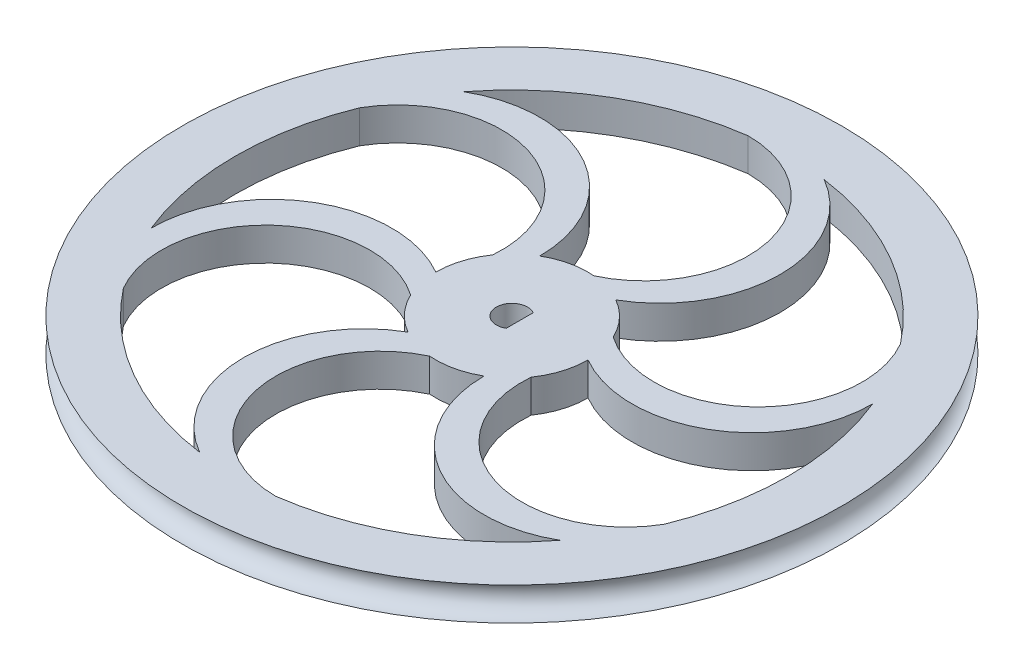
ISO-10303-21;
HEADER;
FILE_DESCRIPTION(('STEP AP214'),'2;1');
FILE_NAME('part.step','',(''),(''),'','','');
FILE_SCHEMA(('AUTOMOTIVE_DESIGN { 1 0 10303 214 1 1 1 1 }'));
ENDSEC;
DATA;
#1=APPLICATION_CONTEXT('core data for automotive mechanical design processes');
#2=APPLICATION_PROTOCOL_DEFINITION('international standard','automotive_design',2000,#1);
#3=PRODUCT_CONTEXT('',#1,'mechanical');
#4=PRODUCT('Part','Part','',(#3));
#5=PRODUCT_RELATED_PRODUCT_CATEGORY('part','',(#4));
#6=PRODUCT_DEFINITION_FORMATION('','',#4);
#7=PRODUCT_DEFINITION_CONTEXT('part definition',#1,'design');
#8=PRODUCT_DEFINITION('design','',#6,#7);
#9=PRODUCT_DEFINITION_SHAPE('','',#8);
#10=(LENGTH_UNIT() NAMED_UNIT(*) SI_UNIT(.MILLI.,.METRE.));
#11=(NAMED_UNIT(*) PLANE_ANGLE_UNIT() SI_UNIT($,.RADIAN.));
#12=(NAMED_UNIT(*) SI_UNIT($,.STERADIAN.) SOLID_ANGLE_UNIT());
#13=UNCERTAINTY_MEASURE_WITH_UNIT(LENGTH_MEASURE(1.E-05),#10,'distance_accuracy_value','');
#14=(GEOMETRIC_REPRESENTATION_CONTEXT(3) GLOBAL_UNCERTAINTY_ASSIGNED_CONTEXT((#13)) GLOBAL_UNIT_ASSIGNED_CONTEXT((#10,
#11,#12)) REPRESENTATION_CONTEXT('',''));
#15=CARTESIAN_POINT('',(0.,0.,0.));
#16=DIRECTION('',(0.,0.,1.));
#17=DIRECTION('',(1.,0.,0.));
#18=AXIS2_PLACEMENT_3D('',#15,#16,#17);
#19=CARTESIAN_POINT('',(0.,3.175,0.));
#20=DIRECTION('',(0.,1.,0.));
#21=DIRECTION('',(0.,0.,1.));
#22=AXIS2_PLACEMENT_3D('',#19,#20,#21);
#23=PLANE('',#22);
#24=CARTESIAN_POINT('',(0.,3.175,0.));
#25=DIRECTION('',(0.,1.,0.));
#26=DIRECTION('',(0.,0.,1.));
#27=AXIS2_PLACEMENT_3D('',#24,#25,#26);
#28=CIRCLE('',#27,1.5);
#29=CARTESIAN_POINT('',(0.749999999999999,3.175,-1.29903810567666));
#30=VERTEX_POINT('',#29);
#31=CARTESIAN_POINT('',(0.749999999999999,3.175,1.29903810567666));
#32=VERTEX_POINT('',#31);
#33=EDGE_CURVE('E192',#30,#32,#28,.T.);
#34=ORIENTED_EDGE('',*,*,#33,.F.);
#35=DIRECTION('',(0.,0.,-1.));
#36=VECTOR('',#35,1.);
#37=CARTESIAN_POINT('',(0.749999999999999,3.175,-1.29903810567666));
#38=LINE('',#37,#36);
#39=EDGE_CURVE('E360',#32,#30,#38,.T.);
#40=ORIENTED_EDGE('',*,*,#39,.F.);
#41=EDGE_LOOP('',(#34,#40));
#42=FACE_BOUND('',#41,.T.);
#43=CARTESIAN_POINT('',(16.0215338061966,3.175,5.01670352250494));
#44=DIRECTION('',(0.,1.,0.));
#45=DIRECTION('',(0.,0.,1.));
#46=AXIS2_PLACEMENT_3D('',#43,#44,#45);
#47=CIRCLE('',#46,10.0334070450099);
#48=CARTESIAN_POINT('',(6.02292123719252,3.175,4.18183609242504));
#49=VERTEX_POINT('',#48);
#50=CARTESIAN_POINT('',(24.7107191936849,3.175,10.0334070450099));
#51=VERTEX_POINT('',#50);
#52=EDGE_CURVE('E402',#49,#51,#47,.T.);
#53=ORIENTED_EDGE('',*,*,#52,.F.);
#54=CARTESIAN_POINT('',(0.,3.175,0.));
#55=DIRECTION('',(0.,1.,0.));
#56=DIRECTION('',(0.,0.,1.));
#57=AXIS2_PLACEMENT_3D('',#54,#55,#56);
#58=CIRCLE('',#57,7.33234841870825);
#59=CARTESIAN_POINT('',(7.33234841870825,3.175,0.));
#60=VERTEX_POINT('',#59);
#61=EDGE_CURVE('E370',#49,#60,#58,.T.);
#62=ORIENTED_EDGE('',*,*,#61,.T.);
#63=CARTESIAN_POINT('',(13.1251386770338,3.175,-10.0334070450099));
#64=DIRECTION('',(0.,1.,0.));
#65=DIRECTION('',(0.,0.,1.));
#66=AXIS2_PLACEMENT_3D('',#63,#64,#65);
#67=CIRCLE('',#66,11.5855805166511);
#68=CARTESIAN_POINT('',(24.7107191936849,3.175,-10.0334070450099));
#69=VERTEX_POINT('',#68);
#70=EDGE_CURVE('E390',#60,#69,#67,.T.);
#71=ORIENTED_EDGE('',*,*,#70,.T.);
#72=CARTESIAN_POINT('',(0.,3.175,0.));
#73=DIRECTION('',(0.,1.,0.));
#74=DIRECTION('',(0.,0.,1.));
#75=AXIS2_PLACEMENT_3D('',#72,#73,#74);
#76=CIRCLE('',#75,26.67);
#77=EDGE_CURVE('E394',#51,#69,#76,.T.);
#78=ORIENTED_EDGE('',*,*,#77,.F.);
#79=EDGE_LOOP('',(#53,#62,#71,#78));
#80=FACE_BOUND('',#79,.T.);
#81=CARTESIAN_POINT('',(12.3553595968424,3.175,-11.3667035225049));
#82=DIRECTION('',(0.,1.,0.));
#83=DIRECTION('',(0.,0.,1.));
#84=AXIS2_PLACEMENT_3D('',#81,#82,#83);
#85=CIRCLE('',#84,10.0334070450099);
#86=CARTESIAN_POINT('',(6.63303690909899,3.175,-3.125084750189));
#87=VERTEX_POINT('',#86);
#88=CARTESIAN_POINT('',(21.0445449843308,3.175,-16.3834070450099));
#89=VERTEX_POINT('',#88);
#90=EDGE_CURVE('E469',#87,#89,#85,.T.);
#91=ORIENTED_EDGE('',*,*,#90,.F.);
#92=CARTESIAN_POINT('',(3.66617420935413,3.175,-6.35));
#93=VERTEX_POINT('',#92);
#94=EDGE_CURVE('E620',#87,#93,#58,.T.);
#95=ORIENTED_EDGE('',*,*,#94,.T.);
#96=CARTESIAN_POINT('',(-2.12661604897142,3.175,-16.3834070450099));
#97=DIRECTION('',(0.,1.,0.));
#98=DIRECTION('',(0.,0.,1.));
#99=AXIS2_PLACEMENT_3D('',#96,#97,#98);
#100=CIRCLE('',#99,11.5855805166511);
#101=CARTESIAN_POINT('',(3.66617420935415,3.175,-26.4168140900198));
#102=VERTEX_POINT('',#101);
#103=EDGE_CURVE('E466',#93,#102,#100,.T.);
#104=ORIENTED_EDGE('',*,*,#103,.T.);
#105=CARTESIAN_POINT('',(0.,3.175,0.));
#106=DIRECTION('',(0.,1.,0.));
#107=DIRECTION('',(0.,0.,1.));
#108=AXIS2_PLACEMENT_3D('',#105,#106,#107);
#109=CIRCLE('',#108,26.67);
#110=EDGE_CURVE('E460',#89,#102,#109,.T.);
#111=ORIENTED_EDGE('',*,*,#110,.F.);
#112=EDGE_LOOP('',(#91,#95,#104,#111));
#113=FACE_BOUND('',#112,.T.);
#114=CARTESIAN_POINT('',(-3.66617420935412,3.175,-16.3834070450099));
#115=DIRECTION('',(0.,1.,0.));
#116=DIRECTION('',(0.,0.,1.));
#117=AXIS2_PLACEMENT_3D('',#114,#115,#116);
#118=CIRCLE('',#117,10.0334070450099);
#119=CARTESIAN_POINT('',(0.610115671906478,3.175,-7.30692084261404));
#120=VERTEX_POINT('',#119);
#121=CARTESIAN_POINT('',(-3.66617420935412,3.175,-26.4168140900198));
#122=VERTEX_POINT('',#121);
#123=EDGE_CURVE('E512',#120,#122,#118,.T.);
#124=ORIENTED_EDGE('',*,*,#123,.F.);
#125=CARTESIAN_POINT('',(-3.66617420935412,3.175,-6.35));
#126=VERTEX_POINT('',#125);
#127=EDGE_CURVE('E623',#120,#126,#58,.T.);
#128=ORIENTED_EDGE('',*,*,#127,.T.);
#129=CARTESIAN_POINT('',(-15.2517547260052,3.175,-6.34999999999999));
#130=DIRECTION('',(0.,1.,0.));
#131=DIRECTION('',(0.,0.,1.));
#132=AXIS2_PLACEMENT_3D('',#129,#130,#131);
#133=CIRCLE('',#132,11.5855805166511);
#134=CARTESIAN_POINT('',(-21.0445449843308,3.175,-16.3834070450099));
#135=VERTEX_POINT('',#134);
#136=EDGE_CURVE('E476',#126,#135,#133,.T.);
#137=ORIENTED_EDGE('',*,*,#136,.T.);
#138=CARTESIAN_POINT('',(0.,3.175,0.));
#139=DIRECTION('',(0.,1.,0.));
#140=DIRECTION('',(0.,0.,1.));
#141=AXIS2_PLACEMENT_3D('',#138,#139,#140);
#142=CIRCLE('',#141,26.67);
#143=EDGE_CURVE('E504',#122,#135,#142,.T.);
#144=ORIENTED_EDGE('',*,*,#143,.F.);
#145=EDGE_LOOP('',(#124,#128,#137,#144));
#146=FACE_BOUND('',#145,.T.);
#147=CARTESIAN_POINT('',(-16.0215338061966,3.175,-5.01670352250494));
#148=DIRECTION('',(0.,1.,0.));
#149=DIRECTION('',(0.,0.,1.));
#150=AXIS2_PLACEMENT_3D('',#147,#148,#149);
#151=CIRCLE('',#150,10.0334070450099);
#152=CARTESIAN_POINT('',(-6.02292123719251,3.175,-4.18183609242505));
#153=VERTEX_POINT('',#152);
#154=CARTESIAN_POINT('',(-24.7107191936849,3.175,-10.0334070450099));
#155=VERTEX_POINT('',#154);
#156=EDGE_CURVE('E424',#153,#155,#151,.T.);
#157=ORIENTED_EDGE('',*,*,#156,.F.);
#158=CARTESIAN_POINT('',(-7.33234841870825,3.175,0.));
#159=VERTEX_POINT('',#158);
#160=EDGE_CURVE('E626',#153,#159,#58,.T.);
#161=ORIENTED_EDGE('',*,*,#160,.T.);
#162=CARTESIAN_POINT('',(-13.1251386770338,3.175,10.0334070450099));
#163=DIRECTION('',(0.,1.,0.));
#164=DIRECTION('',(0.,0.,1.));
#165=AXIS2_PLACEMENT_3D('',#162,#163,#164);
#166=CIRCLE('',#165,11.5855805166511);
#167=CARTESIAN_POINT('',(-24.7107191936849,3.175,10.0334070450099));
#168=VERTEX_POINT('',#167);
#169=EDGE_CURVE('E408',#159,#168,#166,.T.);
#170=ORIENTED_EDGE('',*,*,#169,.T.);
#171=CARTESIAN_POINT('',(0.,3.175,0.));
#172=DIRECTION('',(0.,1.,0.));
#173=DIRECTION('',(0.,0.,1.));
#174=AXIS2_PLACEMENT_3D('',#171,#172,#173);
#175=CIRCLE('',#174,26.67);
#176=EDGE_CURVE('E416',#155,#168,#175,.T.);
#177=ORIENTED_EDGE('',*,*,#176,.F.);
#178=EDGE_LOOP('',(#157,#161,#170,#177));
#179=FACE_BOUND('',#178,.T.);
#180=CARTESIAN_POINT('',(-12.3553595968424,3.175,11.3667035225049));
#181=DIRECTION('',(0.,1.,0.));
#182=DIRECTION('',(0.,0.,1.));
#183=AXIS2_PLACEMENT_3D('',#180,#181,#182);
#184=CIRCLE('',#183,10.0334070450099);
#185=CARTESIAN_POINT('',(-6.63303690909899,3.175,3.12508475018899));
#186=VERTEX_POINT('',#185);
#187=CARTESIAN_POINT('',(-21.0445449843308,3.175,16.3834070450099));
#188=VERTEX_POINT('',#187);
#189=EDGE_CURVE('E446',#186,#188,#184,.T.);
#190=ORIENTED_EDGE('',*,*,#189,.F.);
#191=CARTESIAN_POINT('',(-3.66617420935412,3.175,6.35));
#192=VERTEX_POINT('',#191);
#193=EDGE_CURVE('E369',#186,#192,#58,.T.);
#194=ORIENTED_EDGE('',*,*,#193,.T.);
#195=CARTESIAN_POINT('',(2.12661604897143,3.175,16.3834070450099));
#196=DIRECTION('',(0.,1.,0.));
#197=DIRECTION('',(0.,0.,1.));
#198=AXIS2_PLACEMENT_3D('',#195,#196,#197);
#199=CIRCLE('',#198,11.5855805166511);
#200=CARTESIAN_POINT('',(-3.66617420935415,3.175,26.4168140900197));
#201=VERTEX_POINT('',#200);
#202=EDGE_CURVE('E430',#192,#201,#199,.T.);
#203=ORIENTED_EDGE('',*,*,#202,.T.);
#204=CARTESIAN_POINT('',(0.,3.175,0.));
#205=DIRECTION('',(0.,1.,0.));
#206=DIRECTION('',(0.,0.,1.));
#207=AXIS2_PLACEMENT_3D('',#204,#205,#206);
#208=CIRCLE('',#207,26.67);
#209=EDGE_CURVE('E438',#188,#201,#208,.T.);
#210=ORIENTED_EDGE('',*,*,#209,.F.);
#211=EDGE_LOOP('',(#190,#194,#203,#210));
#212=FACE_BOUND('',#211,.T.);
#213=CARTESIAN_POINT('',(-0.610115671906482,3.175,7.30692084261404));
#214=VERTEX_POINT('',#213);
#215=CARTESIAN_POINT('',(3.66617420935413,3.175,6.35));
#216=VERTEX_POINT('',#215);
#217=EDGE_CURVE('E365',#214,#216,#58,.T.);
#218=ORIENTED_EDGE('',*,*,#217,.T.);
#219=CARTESIAN_POINT('',(15.2517547260052,3.175,6.34999999999999));
#220=DIRECTION('',(0.,1.,0.));
#221=DIRECTION('',(0.,0.,1.));
#222=AXIS2_PLACEMENT_3D('',#219,#220,#221);
#223=CIRCLE('',#222,11.5855805166511);
#224=CARTESIAN_POINT('',(21.0445449843307,3.175,16.3834070450099));
#225=VERTEX_POINT('',#224);
#226=EDGE_CURVE('E452',#216,#225,#223,.T.);
#227=ORIENTED_EDGE('',*,*,#226,.T.);
#228=CARTESIAN_POINT('',(0.,3.175,0.));
#229=DIRECTION('',(0.,1.,0.));
#230=DIRECTION('',(0.,0.,1.));
#231=AXIS2_PLACEMENT_3D('',#228,#229,#230);
#232=CIRCLE('',#231,26.67);
#233=CARTESIAN_POINT('',(3.66617420935413,3.175,26.4168140900198));
#234=VERTEX_POINT('',#233);
#235=EDGE_CURVE('E484',#234,#225,#232,.T.);
#236=ORIENTED_EDGE('',*,*,#235,.F.);
#237=CARTESIAN_POINT('',(3.66617420935413,3.175,16.3834070450099));
#238=DIRECTION('',(0.,1.,0.));
#239=DIRECTION('',(0.,0.,1.));
#240=AXIS2_PLACEMENT_3D('',#237,#238,#239);
#241=CIRCLE('',#240,10.0334070450099);
#242=EDGE_CURVE('E492',#214,#234,#241,.T.);
#243=ORIENTED_EDGE('',*,*,#242,.F.);
#244=EDGE_LOOP('',(#218,#227,#236,#243));
#245=FACE_BOUND('',#244,.T.);
#246=CARTESIAN_POINT('',(0.,3.175,0.));
#247=DIRECTION('',(0.,-1.,0.));
#248=DIRECTION('',(0.,0.,-1.));
#249=AXIS2_PLACEMENT_3D('',#246,#247,#248);
#250=CIRCLE('',#249,31.75);
#251=CARTESIAN_POINT('',(0.,3.175,-31.75));
#252=VERTEX_POINT('',#251);
#253=EDGE_CURVE('E185',#252,#252,#250,.F.);
#254=ORIENTED_EDGE('',*,*,#253,.T.);
#255=EDGE_LOOP('',(#254));
#256=FACE_BOUND('',#255,.T.);
#257=ADVANCED_FACE('F177',(#42,#80,#113,#146,#179,#212,#245,#256),#23,.T.);
#258=CARTESIAN_POINT('',(0.,0.,0.));
#259=DIRECTION('',(0.,1.,0.));
#260=DIRECTION('',(0.,0.,1.));
#261=AXIS2_PLACEMENT_3D('',#258,#259,#260);
#262=PLANE('',#261);
#263=DIRECTION('',(0.,0.,-1.));
#264=VECTOR('',#263,1.);
#265=CARTESIAN_POINT('',(0.749999999999999,0.,-1.29903810567666));
#266=LINE('',#265,#264);
#267=CARTESIAN_POINT('',(0.749999999999999,0.,1.29903810567666));
#268=VERTEX_POINT('',#267);
#269=CARTESIAN_POINT('',(0.749999999999999,0.,-1.29903810567666));
#270=VERTEX_POINT('',#269);
#271=EDGE_CURVE('E353',#268,#270,#266,.T.);
#272=ORIENTED_EDGE('',*,*,#271,.T.);
#273=CARTESIAN_POINT('',(0.,0.,0.));
#274=DIRECTION('',(0.,1.,0.));
#275=DIRECTION('',(0.,0.,1.));
#276=AXIS2_PLACEMENT_3D('',#273,#274,#275);
#277=CIRCLE('',#276,1.5);
#278=EDGE_CURVE('E197',#270,#268,#277,.T.);
#279=ORIENTED_EDGE('',*,*,#278,.T.);
#280=EDGE_LOOP('',(#272,#279));
#281=FACE_BOUND('',#280,.T.);
#282=CARTESIAN_POINT('',(0.,0.,0.));
#283=DIRECTION('',(0.,1.,0.));
#284=DIRECTION('',(0.,0.,1.));
#285=AXIS2_PLACEMENT_3D('',#282,#283,#284);
#286=CIRCLE('',#285,7.33234841870825);
#287=CARTESIAN_POINT('',(7.33234841870825,0.,0.));
#288=VERTEX_POINT('',#287);
#289=CARTESIAN_POINT('',(6.02292123719252,0.,4.18183609242504));
#290=VERTEX_POINT('',#289);
#291=EDGE_CURVE('E373',#288,#290,#286,.F.);
#292=ORIENTED_EDGE('',*,*,#291,.T.);
#293=CARTESIAN_POINT('',(16.0215338061966,0.,5.01670352250494));
#294=DIRECTION('',(0.,1.,0.));
#295=DIRECTION('',(0.,0.,1.));
#296=AXIS2_PLACEMENT_3D('',#293,#294,#295);
#297=CIRCLE('',#296,10.0334070450099);
#298=CARTESIAN_POINT('',(24.7107191936849,0.,10.0334070450099));
#299=VERTEX_POINT('',#298);
#300=EDGE_CURVE('E393',#290,#299,#297,.T.);
#301=ORIENTED_EDGE('',*,*,#300,.T.);
#302=CARTESIAN_POINT('',(0.,0.,0.));
#303=DIRECTION('',(0.,1.,0.));
#304=DIRECTION('',(0.,0.,1.));
#305=AXIS2_PLACEMENT_3D('',#302,#303,#304);
#306=CIRCLE('',#305,26.67);
#307=CARTESIAN_POINT('',(24.7107191936849,0.,-10.0334070450099));
#308=VERTEX_POINT('',#307);
#309=EDGE_CURVE('E396',#299,#308,#306,.T.);
#310=ORIENTED_EDGE('',*,*,#309,.T.);
#311=CARTESIAN_POINT('',(13.1251386770338,0.,-10.0334070450099));
#312=DIRECTION('',(0.,1.,0.));
#313=DIRECTION('',(0.,0.,1.));
#314=AXIS2_PLACEMENT_3D('',#311,#312,#313);
#315=CIRCLE('',#314,11.5855805166511);
#316=EDGE_CURVE('E391',#288,#308,#315,.T.);
#317=ORIENTED_EDGE('',*,*,#316,.F.);
#318=EDGE_LOOP('',(#292,#301,#310,#317));
#319=FACE_BOUND('',#318,.T.);
#320=CARTESIAN_POINT('',(3.66617420935413,0.,-6.35));
#321=VERTEX_POINT('',#320);
#322=CARTESIAN_POINT('',(6.63303690909899,0.,-3.125084750189));
#323=VERTEX_POINT('',#322);
#324=EDGE_CURVE('E659',#321,#323,#286,.F.);
#325=ORIENTED_EDGE('',*,*,#324,.T.);
#326=CARTESIAN_POINT('',(12.3553595968424,0.,-11.3667035225049));
#327=DIRECTION('',(0.,1.,0.));
#328=DIRECTION('',(0.,0.,1.));
#329=AXIS2_PLACEMENT_3D('',#326,#327,#328);
#330=CIRCLE('',#329,10.0334070450099);
#331=CARTESIAN_POINT('',(21.0445449843308,0.,-16.3834070450099));
#332=VERTEX_POINT('',#331);
#333=EDGE_CURVE('E459',#323,#332,#330,.T.);
#334=ORIENTED_EDGE('',*,*,#333,.T.);
#335=CARTESIAN_POINT('',(0.,0.,0.));
#336=DIRECTION('',(0.,1.,0.));
#337=DIRECTION('',(0.,0.,1.));
#338=AXIS2_PLACEMENT_3D('',#335,#336,#337);
#339=CIRCLE('',#338,26.67);
#340=CARTESIAN_POINT('',(3.66617420935415,0.,-26.4168140900198));
#341=VERTEX_POINT('',#340);
#342=EDGE_CURVE('E462',#332,#341,#339,.T.);
#343=ORIENTED_EDGE('',*,*,#342,.T.);
#344=CARTESIAN_POINT('',(-2.12661604897142,0.,-16.3834070450099));
#345=DIRECTION('',(0.,1.,0.));
#346=DIRECTION('',(0.,0.,1.));
#347=AXIS2_PLACEMENT_3D('',#344,#345,#346);
#348=CIRCLE('',#347,11.5855805166511);
#349=EDGE_CURVE('E457',#321,#341,#348,.T.);
#350=ORIENTED_EDGE('',*,*,#349,.F.);
#351=EDGE_LOOP('',(#325,#334,#343,#350));
#352=FACE_BOUND('',#351,.T.);
#353=CARTESIAN_POINT('',(-3.66617420935412,0.,-6.35));
#354=VERTEX_POINT('',#353);
#355=CARTESIAN_POINT('',(0.610115671906478,0.,-7.30692084261404));
#356=VERTEX_POINT('',#355);
#357=EDGE_CURVE('E655',#354,#356,#286,.F.);
#358=ORIENTED_EDGE('',*,*,#357,.T.);
#359=CARTESIAN_POINT('',(-3.66617420935412,0.,-16.3834070450099));
#360=DIRECTION('',(0.,1.,0.));
#361=DIRECTION('',(0.,0.,1.));
#362=AXIS2_PLACEMENT_3D('',#359,#360,#361);
#363=CIRCLE('',#362,10.0334070450099);
#364=CARTESIAN_POINT('',(-3.66617420935412,0.,-26.4168140900198));
#365=VERTEX_POINT('',#364);
#366=EDGE_CURVE('E503',#356,#365,#363,.T.);
#367=ORIENTED_EDGE('',*,*,#366,.T.);
#368=CARTESIAN_POINT('',(0.,0.,0.));
#369=DIRECTION('',(0.,1.,0.));
#370=DIRECTION('',(0.,0.,1.));
#371=AXIS2_PLACEMENT_3D('',#368,#369,#370);
#372=CIRCLE('',#371,26.67);
#373=CARTESIAN_POINT('',(-21.0445449843308,0.,-16.3834070450099));
#374=VERTEX_POINT('',#373);
#375=EDGE_CURVE('E506',#365,#374,#372,.T.);
#376=ORIENTED_EDGE('',*,*,#375,.T.);
#377=CARTESIAN_POINT('',(-15.2517547260052,0.,-6.34999999999999));
#378=DIRECTION('',(0.,1.,0.));
#379=DIRECTION('',(0.,0.,1.));
#380=AXIS2_PLACEMENT_3D('',#377,#378,#379);
#381=CIRCLE('',#380,11.5855805166511);
#382=EDGE_CURVE('E501',#354,#374,#381,.T.);
#383=ORIENTED_EDGE('',*,*,#382,.F.);
#384=EDGE_LOOP('',(#358,#367,#376,#383));
#385=FACE_BOUND('',#384,.T.);
#386=CARTESIAN_POINT('',(-7.33234841870825,0.,0.));
#387=VERTEX_POINT('',#386);
#388=CARTESIAN_POINT('',(-6.02292123719251,0.,-4.18183609242505));
#389=VERTEX_POINT('',#388);
#390=EDGE_CURVE('E654',#387,#389,#286,.F.);
#391=ORIENTED_EDGE('',*,*,#390,.T.);
#392=CARTESIAN_POINT('',(-16.0215338061966,0.,-5.01670352250494));
#393=DIRECTION('',(0.,1.,0.));
#394=DIRECTION('',(0.,0.,1.));
#395=AXIS2_PLACEMENT_3D('',#392,#393,#394);
#396=CIRCLE('',#395,10.0334070450099);
#397=CARTESIAN_POINT('',(-24.7107191936849,0.,-10.0334070450099));
#398=VERTEX_POINT('',#397);
#399=EDGE_CURVE('E415',#389,#398,#396,.T.);
#400=ORIENTED_EDGE('',*,*,#399,.T.);
#401=CARTESIAN_POINT('',(0.,0.,0.));
#402=DIRECTION('',(0.,1.,0.));
#403=DIRECTION('',(0.,0.,1.));
#404=AXIS2_PLACEMENT_3D('',#401,#402,#403);
#405=CIRCLE('',#404,26.67);
#406=CARTESIAN_POINT('',(-24.7107191936849,0.,10.0334070450099));
#407=VERTEX_POINT('',#406);
#408=EDGE_CURVE('E418',#398,#407,#405,.T.);
#409=ORIENTED_EDGE('',*,*,#408,.T.);
#410=CARTESIAN_POINT('',(-13.1251386770338,0.,10.0334070450099));
#411=DIRECTION('',(0.,1.,0.));
#412=DIRECTION('',(0.,0.,1.));
#413=AXIS2_PLACEMENT_3D('',#410,#411,#412);
#414=CIRCLE('',#413,11.5855805166511);
#415=EDGE_CURVE('E413',#387,#407,#414,.T.);
#416=ORIENTED_EDGE('',*,*,#415,.F.);
#417=EDGE_LOOP('',(#391,#400,#409,#416));
#418=FACE_BOUND('',#417,.T.);
#419=CARTESIAN_POINT('',(-3.66617420935412,0.,6.35));
#420=VERTEX_POINT('',#419);
#421=CARTESIAN_POINT('',(-6.63303690909899,0.,3.12508475018899));
#422=VERTEX_POINT('',#421);
#423=EDGE_CURVE('E374',#420,#422,#286,.F.);
#424=ORIENTED_EDGE('',*,*,#423,.T.);
#425=CARTESIAN_POINT('',(-12.3553595968424,0.,11.3667035225049));
#426=DIRECTION('',(0.,1.,0.));
#427=DIRECTION('',(0.,0.,1.));
#428=AXIS2_PLACEMENT_3D('',#425,#426,#427);
#429=CIRCLE('',#428,10.0334070450099);
#430=CARTESIAN_POINT('',(-21.0445449843308,0.,16.3834070450099));
#431=VERTEX_POINT('',#430);
#432=EDGE_CURVE('E437',#422,#431,#429,.T.);
#433=ORIENTED_EDGE('',*,*,#432,.T.);
#434=CARTESIAN_POINT('',(0.,0.,0.));
#435=DIRECTION('',(0.,1.,0.));
#436=DIRECTION('',(0.,0.,1.));
#437=AXIS2_PLACEMENT_3D('',#434,#435,#436);
#438=CIRCLE('',#437,26.67);
#439=CARTESIAN_POINT('',(-3.66617420935415,0.,26.4168140900197));
#440=VERTEX_POINT('',#439);
#441=EDGE_CURVE('E440',#431,#440,#438,.T.);
#442=ORIENTED_EDGE('',*,*,#441,.T.);
#443=CARTESIAN_POINT('',(2.12661604897143,0.,16.3834070450099));
#444=DIRECTION('',(0.,1.,0.));
#445=DIRECTION('',(0.,0.,1.));
#446=AXIS2_PLACEMENT_3D('',#443,#444,#445);
#447=CIRCLE('',#446,11.5855805166511);
#448=EDGE_CURVE('E435',#420,#440,#447,.T.);
#449=ORIENTED_EDGE('',*,*,#448,.F.);
#450=EDGE_LOOP('',(#424,#433,#442,#449));
#451=FACE_BOUND('',#450,.T.);
#452=CARTESIAN_POINT('',(0.,0.,0.));
#453=DIRECTION('',(0.,-1.,0.));
#454=DIRECTION('',(0.,0.,-1.));
#455=AXIS2_PLACEMENT_3D('',#452,#453,#454);
#456=CIRCLE('',#455,31.75);
#457=CARTESIAN_POINT('',(0.,0.,-31.75));
#458=VERTEX_POINT('',#457);
#459=EDGE_CURVE('E518',#458,#458,#456,.F.);
#460=ORIENTED_EDGE('',*,*,#459,.F.);
#461=EDGE_LOOP('',(#460));
#462=FACE_BOUND('',#461,.T.);
#463=CARTESIAN_POINT('',(15.2517547260052,0.,6.34999999999999));
#464=DIRECTION('',(0.,1.,0.));
#465=DIRECTION('',(0.,0.,1.));
#466=AXIS2_PLACEMENT_3D('',#463,#464,#465);
#467=CIRCLE('',#466,11.5855805166511);
#468=CARTESIAN_POINT('',(3.66617420935413,0.,6.35));
#469=VERTEX_POINT('',#468);
#470=CARTESIAN_POINT('',(21.0445449843307,0.,16.3834070450099));
#471=VERTEX_POINT('',#470);
#472=EDGE_CURVE('E481',#469,#471,#467,.T.);
#473=ORIENTED_EDGE('',*,*,#472,.F.);
#474=CARTESIAN_POINT('',(-0.610115671906484,0.,7.30692084261404));
#475=VERTEX_POINT('',#474);
#476=EDGE_CURVE('E371',#469,#475,#286,.F.);
#477=ORIENTED_EDGE('',*,*,#476,.T.);
#478=CARTESIAN_POINT('',(3.66617420935413,0.,16.3834070450099));
#479=DIRECTION('',(0.,1.,0.));
#480=DIRECTION('',(0.,0.,1.));
#481=AXIS2_PLACEMENT_3D('',#478,#479,#480);
#482=CIRCLE('',#481,10.0334070450099);
#483=CARTESIAN_POINT('',(3.66617420935413,0.,26.4168140900198));
#484=VERTEX_POINT('',#483);
#485=EDGE_CURVE('E483',#475,#484,#482,.T.);
#486=ORIENTED_EDGE('',*,*,#485,.T.);
#487=CARTESIAN_POINT('',(0.,0.,0.));
#488=DIRECTION('',(0.,1.,0.));
#489=DIRECTION('',(0.,0.,1.));
#490=AXIS2_PLACEMENT_3D('',#487,#488,#489);
#491=CIRCLE('',#490,26.67);
#492=EDGE_CURVE('E486',#484,#471,#491,.T.);
#493=ORIENTED_EDGE('',*,*,#492,.T.);
#494=EDGE_LOOP('',(#473,#477,#486,#493));
#495=FACE_BOUND('',#494,.T.);
#496=ADVANCED_FACE('F179',(#281,#319,#352,#385,#418,#451,#462,#495),#262,.F.);
#497=CARTESIAN_POINT('',(0.,1.5875,0.));
#498=DIRECTION('',(0.,-1.,0.));
#499=DIRECTION('',(0.,0.,-1.));
#500=AXIS2_PLACEMENT_3D('',#497,#498,#499);
#501=TOROIDAL_SURFACE('',#500,31.75,1.5875);
#502=ORIENTED_EDGE('',*,*,#253,.F.);
#503=EDGE_LOOP('',(#502));
#504=FACE_BOUND('',#503,.T.);
#505=ORIENTED_EDGE('',*,*,#459,.T.);
#506=EDGE_LOOP('',(#505));
#507=FACE_BOUND('',#506,.T.);
#508=ADVANCED_FACE('F528',(#504,#507),#501,.F.);
#509=CARTESIAN_POINT('',(-15.2517547260052,0.,-6.34999999999999));
#510=DIRECTION('',(0.,1.,0.));
#511=DIRECTION('',(0.,0.,1.));
#512=AXIS2_PLACEMENT_3D('',#509,#510,#511);
#513=CYLINDRICAL_SURFACE('',#512,11.5855805166511);
#514=ORIENTED_EDGE('',*,*,#136,.F.);
#515=DIRECTION('',(0.,1.,0.));
#516=VECTOR('',#515,1.);
#517=CARTESIAN_POINT('',(-3.66617420935412,0.,-6.35));
#518=LINE('',#517,#516);
#519=EDGE_CURVE('E509',#354,#126,#518,.T.);
#520=ORIENTED_EDGE('',*,*,#519,.F.);
#521=ORIENTED_EDGE('',*,*,#382,.T.);
#522=DIRECTION('',(0.,1.,0.));
#523=VECTOR('',#522,1.);
#524=CARTESIAN_POINT('',(-21.0445449843308,0.,-16.3834070450099));
#525=LINE('',#524,#523);
#526=EDGE_CURVE('E516',#374,#135,#525,.T.);
#527=ORIENTED_EDGE('',*,*,#526,.T.);
#528=EDGE_LOOP('',(#514,#520,#521,#527));
#529=FACE_BOUND('',#528,.T.);
#530=ADVANCED_FACE('F531',(#529),#513,.T.);
#531=CARTESIAN_POINT('',(0.,0.,0.));
#532=DIRECTION('',(0.,1.,0.));
#533=DIRECTION('',(0.,0.,1.));
#534=AXIS2_PLACEMENT_3D('',#531,#532,#533);
#535=CYLINDRICAL_SURFACE('',#534,26.67);
#536=ORIENTED_EDGE('',*,*,#143,.T.);
#537=ORIENTED_EDGE('',*,*,#526,.F.);
#538=ORIENTED_EDGE('',*,*,#375,.F.);
#539=DIRECTION('',(0.,1.,0.));
#540=VECTOR('',#539,1.);
#541=CARTESIAN_POINT('',(-3.66617420935412,0.,-26.4168140900198));
#542=LINE('',#541,#540);
#543=EDGE_CURVE('E519',#365,#122,#542,.T.);
#544=ORIENTED_EDGE('',*,*,#543,.T.);
#545=EDGE_LOOP('',(#536,#537,#538,#544));
#546=FACE_BOUND('',#545,.T.);
#547=ADVANCED_FACE('F576',(#546),#535,.F.);
#548=CARTESIAN_POINT('',(-3.66617420935412,0.,-16.3834070450099));
#549=DIRECTION('',(0.,1.,0.));
#550=DIRECTION('',(0.,0.,1.));
#551=AXIS2_PLACEMENT_3D('',#548,#549,#550);
#552=CYLINDRICAL_SURFACE('',#551,10.0334070450099);
#553=ORIENTED_EDGE('',*,*,#366,.F.);
#554=DIRECTION('',(0.,1.,0.));
#555=VECTOR('',#554,1.);
#556=CARTESIAN_POINT('',(0.610115671906475,1.5875,-7.30692084261404));
#557=LINE('',#556,#555);
#558=EDGE_CURVE('E387',#356,#120,#557,.T.);
#559=ORIENTED_EDGE('',*,*,#558,.T.);
#560=ORIENTED_EDGE('',*,*,#123,.T.);
#561=ORIENTED_EDGE('',*,*,#543,.F.);
#562=EDGE_LOOP('',(#553,#559,#560,#561));
#563=FACE_BOUND('',#562,.T.);
#564=ADVANCED_FACE('F578',(#563),#552,.F.);
#565=CARTESIAN_POINT('',(13.1251386770338,0.,-10.0334070450099));
#566=DIRECTION('',(0.,1.,0.));
#567=DIRECTION('',(0.,0.,1.));
#568=AXIS2_PLACEMENT_3D('',#565,#566,#567);
#569=CYLINDRICAL_SURFACE('',#568,11.5855805166511);
#570=ORIENTED_EDGE('',*,*,#70,.F.);
#571=DIRECTION('',(0.,1.,0.));
#572=VECTOR('',#571,1.);
#573=CARTESIAN_POINT('',(7.33234841870825,0.,0.));
#574=LINE('',#573,#572);
#575=EDGE_CURVE('E399',#288,#60,#574,.T.);
#576=ORIENTED_EDGE('',*,*,#575,.F.);
#577=ORIENTED_EDGE('',*,*,#316,.T.);
#578=DIRECTION('',(0.,1.,0.));
#579=VECTOR('',#578,1.);
#580=CARTESIAN_POINT('',(24.7107191936849,0.,-10.0334070450099));
#581=LINE('',#580,#579);
#582=EDGE_CURVE('E406',#308,#69,#581,.T.);
#583=ORIENTED_EDGE('',*,*,#582,.T.);
#584=EDGE_LOOP('',(#570,#576,#577,#583));
#585=FACE_BOUND('',#584,.T.);
#586=ADVANCED_FACE('F581',(#585),#569,.T.);
#587=CARTESIAN_POINT('',(0.,0.,0.));
#588=DIRECTION('',(0.,1.,0.));
#589=DIRECTION('',(0.,0.,1.));
#590=AXIS2_PLACEMENT_3D('',#587,#588,#589);
#591=CYLINDRICAL_SURFACE('',#590,26.67);
#592=ORIENTED_EDGE('',*,*,#77,.T.);
#593=ORIENTED_EDGE('',*,*,#582,.F.);
#594=ORIENTED_EDGE('',*,*,#309,.F.);
#595=DIRECTION('',(0.,1.,0.));
#596=VECTOR('',#595,1.);
#597=CARTESIAN_POINT('',(24.7107191936849,0.,10.0334070450099));
#598=LINE('',#597,#596);
#599=EDGE_CURVE('E409',#299,#51,#598,.T.);
#600=ORIENTED_EDGE('',*,*,#599,.T.);
#601=EDGE_LOOP('',(#592,#593,#594,#600));
#602=FACE_BOUND('',#601,.T.);
#603=ADVANCED_FACE('F608',(#602),#591,.F.);
#604=CARTESIAN_POINT('',(16.0215338061966,0.,5.01670352250494));
#605=DIRECTION('',(0.,1.,0.));
#606=DIRECTION('',(0.,0.,1.));
#607=AXIS2_PLACEMENT_3D('',#604,#605,#606);
#608=CYLINDRICAL_SURFACE('',#607,10.0334070450099);
#609=ORIENTED_EDGE('',*,*,#300,.F.);
#610=DIRECTION('',(0.,1.,0.));
#611=VECTOR('',#610,1.);
#612=CARTESIAN_POINT('',(6.02292123719252,1.5875,4.18183609242503));
#613=LINE('',#612,#611);
#614=EDGE_CURVE('E384',#290,#49,#613,.T.);
#615=ORIENTED_EDGE('',*,*,#614,.T.);
#616=ORIENTED_EDGE('',*,*,#52,.T.);
#617=ORIENTED_EDGE('',*,*,#599,.F.);
#618=EDGE_LOOP('',(#609,#615,#616,#617));
#619=FACE_BOUND('',#618,.T.);
#620=ADVANCED_FACE('F603',(#619),#608,.F.);
#621=CARTESIAN_POINT('',(-2.12661604897142,0.,-16.3834070450099));
#622=DIRECTION('',(0.,1.,0.));
#623=DIRECTION('',(0.,0.,1.));
#624=AXIS2_PLACEMENT_3D('',#621,#622,#623);
#625=CYLINDRICAL_SURFACE('',#624,11.5855805166511);
#626=ORIENTED_EDGE('',*,*,#103,.F.);
#627=DIRECTION('',(0.,1.,0.));
#628=VECTOR('',#627,1.);
#629=CARTESIAN_POINT('',(3.66617420935413,0.,-6.35));
#630=LINE('',#629,#628);
#631=EDGE_CURVE('E465',#321,#93,#630,.T.);
#632=ORIENTED_EDGE('',*,*,#631,.F.);
#633=ORIENTED_EDGE('',*,*,#349,.T.);
#634=DIRECTION('',(0.,1.,0.));
#635=VECTOR('',#634,1.);
#636=CARTESIAN_POINT('',(3.66617420935415,0.,-26.4168140900198));
#637=LINE('',#636,#635);
#638=EDGE_CURVE('E474',#341,#102,#637,.T.);
#639=ORIENTED_EDGE('',*,*,#638,.T.);
#640=EDGE_LOOP('',(#626,#632,#633,#639));
#641=FACE_BOUND('',#640,.T.);
#642=ADVANCED_FACE('F596',(#641),#625,.T.);
#643=CARTESIAN_POINT('',(0.,0.,0.));
#644=DIRECTION('',(0.,1.,0.));
#645=DIRECTION('',(0.,0.,1.));
#646=AXIS2_PLACEMENT_3D('',#643,#644,#645);
#647=CYLINDRICAL_SURFACE('',#646,26.67);
#648=ORIENTED_EDGE('',*,*,#110,.T.);
#649=ORIENTED_EDGE('',*,*,#638,.F.);
#650=ORIENTED_EDGE('',*,*,#342,.F.);
#651=DIRECTION('',(0.,1.,0.));
#652=VECTOR('',#651,1.);
#653=CARTESIAN_POINT('',(21.0445449843308,0.,-16.3834070450099));
#654=LINE('',#653,#652);
#655=EDGE_CURVE('E477',#332,#89,#654,.T.);
#656=ORIENTED_EDGE('',*,*,#655,.T.);
#657=EDGE_LOOP('',(#648,#649,#650,#656));
#658=FACE_BOUND('',#657,.T.);
#659=ADVANCED_FACE('F590',(#658),#647,.F.);
#660=CARTESIAN_POINT('',(12.3553595968424,0.,-11.3667035225049));
#661=DIRECTION('',(0.,1.,0.));
#662=DIRECTION('',(0.,0.,1.));
#663=AXIS2_PLACEMENT_3D('',#660,#661,#662);
#664=CYLINDRICAL_SURFACE('',#663,10.0334070450099);
#665=ORIENTED_EDGE('',*,*,#333,.F.);
#666=DIRECTION('',(0.,1.,0.));
#667=VECTOR('',#666,1.);
#668=CARTESIAN_POINT('',(6.63303690909899,1.5875,-3.125084750189));
#669=LINE('',#668,#667);
#670=EDGE_CURVE('E381',#323,#87,#669,.T.);
#671=ORIENTED_EDGE('',*,*,#670,.T.);
#672=ORIENTED_EDGE('',*,*,#90,.T.);
#673=ORIENTED_EDGE('',*,*,#655,.F.);
#674=EDGE_LOOP('',(#665,#671,#672,#673));
#675=FACE_BOUND('',#674,.T.);
#676=ADVANCED_FACE('F586',(#675),#664,.F.);
#677=CARTESIAN_POINT('',(15.2517547260052,0.,6.34999999999999));
#678=DIRECTION('',(0.,1.,0.));
#679=DIRECTION('',(0.,0.,1.));
#680=AXIS2_PLACEMENT_3D('',#677,#678,#679);
#681=CYLINDRICAL_SURFACE('',#680,11.5855805166511);
#682=ORIENTED_EDGE('',*,*,#226,.F.);
#683=DIRECTION('',(0.,1.,0.));
#684=VECTOR('',#683,1.);
#685=CARTESIAN_POINT('',(3.66617420935412,0.,6.35));
#686=LINE('',#685,#684);
#687=EDGE_CURVE('E489',#469,#216,#686,.T.);
#688=ORIENTED_EDGE('',*,*,#687,.F.);
#689=ORIENTED_EDGE('',*,*,#472,.T.);
#690=DIRECTION('',(0.,1.,0.));
#691=VECTOR('',#690,1.);
#692=CARTESIAN_POINT('',(21.0445449843307,0.,16.3834070450099));
#693=LINE('',#692,#691);
#694=EDGE_CURVE('E470',#471,#225,#693,.T.);
#695=ORIENTED_EDGE('',*,*,#694,.T.);
#696=EDGE_LOOP('',(#682,#688,#689,#695));
#697=FACE_BOUND('',#696,.T.);
#698=ADVANCED_FACE('F544',(#697),#681,.T.);
#699=CARTESIAN_POINT('',(0.,0.,0.));
#700=DIRECTION('',(0.,1.,0.));
#701=DIRECTION('',(0.,0.,1.));
#702=AXIS2_PLACEMENT_3D('',#699,#700,#701);
#703=CYLINDRICAL_SURFACE('',#702,26.67);
#704=ORIENTED_EDGE('',*,*,#235,.T.);
#705=ORIENTED_EDGE('',*,*,#694,.F.);
#706=ORIENTED_EDGE('',*,*,#492,.F.);
#707=DIRECTION('',(0.,1.,0.));
#708=VECTOR('',#707,1.);
#709=CARTESIAN_POINT('',(3.66617420935413,0.,26.4168140900198));
#710=LINE('',#709,#708);
#711=EDGE_CURVE('E497',#484,#234,#710,.T.);
#712=ORIENTED_EDGE('',*,*,#711,.T.);
#713=EDGE_LOOP('',(#704,#705,#706,#712));
#714=FACE_BOUND('',#713,.T.);
#715=ADVANCED_FACE('F546',(#714),#703,.F.);
#716=CARTESIAN_POINT('',(3.66617420935413,0.,16.3834070450099));
#717=DIRECTION('',(0.,1.,0.));
#718=DIRECTION('',(0.,0.,1.));
#719=AXIS2_PLACEMENT_3D('',#716,#717,#718);
#720=CYLINDRICAL_SURFACE('',#719,10.0334070450099);
#721=ORIENTED_EDGE('',*,*,#485,.F.);
#722=DIRECTION('',(0.,1.,0.));
#723=VECTOR('',#722,1.);
#724=CARTESIAN_POINT('',(-0.61011567190648,1.5875,7.30692084261404));
#725=LINE('',#724,#723);
#726=EDGE_CURVE('E378',#475,#214,#725,.T.);
#727=ORIENTED_EDGE('',*,*,#726,.T.);
#728=ORIENTED_EDGE('',*,*,#242,.T.);
#729=ORIENTED_EDGE('',*,*,#711,.F.);
#730=EDGE_LOOP('',(#721,#727,#728,#729));
#731=FACE_BOUND('',#730,.T.);
#732=ADVANCED_FACE('F555',(#731),#720,.F.);
#733=CARTESIAN_POINT('',(-13.1251386770338,0.,10.0334070450099));
#734=DIRECTION('',(0.,1.,0.));
#735=DIRECTION('',(0.,0.,1.));
#736=AXIS2_PLACEMENT_3D('',#733,#734,#735);
#737=CYLINDRICAL_SURFACE('',#736,11.5855805166511);
#738=ORIENTED_EDGE('',*,*,#169,.F.);
#739=DIRECTION('',(0.,1.,0.));
#740=VECTOR('',#739,1.);
#741=CARTESIAN_POINT('',(-7.33234841870825,0.,0.));
#742=LINE('',#741,#740);
#743=EDGE_CURVE('E421',#387,#159,#742,.T.);
#744=ORIENTED_EDGE('',*,*,#743,.F.);
#745=ORIENTED_EDGE('',*,*,#415,.T.);
#746=DIRECTION('',(0.,1.,0.));
#747=VECTOR('',#746,1.);
#748=CARTESIAN_POINT('',(-24.7107191936849,0.,10.0334070450099));
#749=LINE('',#748,#747);
#750=EDGE_CURVE('E428',#407,#168,#749,.T.);
#751=ORIENTED_EDGE('',*,*,#750,.T.);
#752=EDGE_LOOP('',(#738,#744,#745,#751));
#753=FACE_BOUND('',#752,.T.);
#754=ADVANCED_FACE('F557',(#753),#737,.T.);
#755=CARTESIAN_POINT('',(0.,0.,0.));
#756=DIRECTION('',(0.,1.,0.));
#757=DIRECTION('',(0.,0.,1.));
#758=AXIS2_PLACEMENT_3D('',#755,#756,#757);
#759=CYLINDRICAL_SURFACE('',#758,26.67);
#760=ORIENTED_EDGE('',*,*,#176,.T.);
#761=ORIENTED_EDGE('',*,*,#750,.F.);
#762=ORIENTED_EDGE('',*,*,#408,.F.);
#763=DIRECTION('',(0.,1.,0.));
#764=VECTOR('',#763,1.);
#765=CARTESIAN_POINT('',(-24.7107191936849,0.,-10.0334070450099));
#766=LINE('',#765,#764);
#767=EDGE_CURVE('E431',#398,#155,#766,.T.);
#768=ORIENTED_EDGE('',*,*,#767,.T.);
#769=EDGE_LOOP('',(#760,#761,#762,#768));
#770=FACE_BOUND('',#769,.T.);
#771=ADVANCED_FACE('F563',(#770),#759,.F.);
#772=CARTESIAN_POINT('',(-16.0215338061966,0.,-5.01670352250494));
#773=DIRECTION('',(0.,1.,0.));
#774=DIRECTION('',(0.,0.,1.));
#775=AXIS2_PLACEMENT_3D('',#772,#773,#774);
#776=CYLINDRICAL_SURFACE('',#775,10.0334070450099);
#777=ORIENTED_EDGE('',*,*,#399,.F.);
#778=DIRECTION('',(0.,1.,0.));
#779=VECTOR('',#778,1.);
#780=CARTESIAN_POINT('',(-6.02292123719251,1.5875,-4.18183609242505));
#781=LINE('',#780,#779);
#782=EDGE_CURVE('E375',#389,#153,#781,.T.);
#783=ORIENTED_EDGE('',*,*,#782,.T.);
#784=ORIENTED_EDGE('',*,*,#156,.T.);
#785=ORIENTED_EDGE('',*,*,#767,.F.);
#786=EDGE_LOOP('',(#777,#783,#784,#785));
#787=FACE_BOUND('',#786,.T.);
#788=ADVANCED_FACE('F687',(#787),#776,.F.);
#789=CARTESIAN_POINT('',(2.12661604897143,0.,16.3834070450099));
#790=DIRECTION('',(0.,1.,0.));
#791=DIRECTION('',(0.,0.,1.));
#792=AXIS2_PLACEMENT_3D('',#789,#790,#791);
#793=CYLINDRICAL_SURFACE('',#792,11.5855805166511);
#794=ORIENTED_EDGE('',*,*,#202,.F.);
#795=DIRECTION('',(0.,1.,0.));
#796=VECTOR('',#795,1.);
#797=CARTESIAN_POINT('',(-3.66617420935412,0.,6.35));
#798=LINE('',#797,#796);
#799=EDGE_CURVE('E443',#420,#192,#798,.T.);
#800=ORIENTED_EDGE('',*,*,#799,.F.);
#801=ORIENTED_EDGE('',*,*,#448,.T.);
#802=DIRECTION('',(0.,1.,0.));
#803=VECTOR('',#802,1.);
#804=CARTESIAN_POINT('',(-3.66617420935415,0.,26.4168140900197));
#805=LINE('',#804,#803);
#806=EDGE_CURVE('E450',#440,#201,#805,.T.);
#807=ORIENTED_EDGE('',*,*,#806,.T.);
#808=EDGE_LOOP('',(#794,#800,#801,#807));
#809=FACE_BOUND('',#808,.T.);
#810=ADVANCED_FACE('F642',(#809),#793,.T.);
#811=CARTESIAN_POINT('',(0.,0.,0.));
#812=DIRECTION('',(0.,1.,0.));
#813=DIRECTION('',(0.,0.,1.));
#814=AXIS2_PLACEMENT_3D('',#811,#812,#813);
#815=CYLINDRICAL_SURFACE('',#814,26.67);
#816=ORIENTED_EDGE('',*,*,#209,.T.);
#817=ORIENTED_EDGE('',*,*,#806,.F.);
#818=ORIENTED_EDGE('',*,*,#441,.F.);
#819=DIRECTION('',(0.,1.,0.));
#820=VECTOR('',#819,1.);
#821=CARTESIAN_POINT('',(-21.0445449843308,0.,16.3834070450099));
#822=LINE('',#821,#820);
#823=EDGE_CURVE('E453',#431,#188,#822,.T.);
#824=ORIENTED_EDGE('',*,*,#823,.T.);
#825=EDGE_LOOP('',(#816,#817,#818,#824));
#826=FACE_BOUND('',#825,.T.);
#827=ADVANCED_FACE('F647',(#826),#815,.F.);
#828=CARTESIAN_POINT('',(-12.3553595968424,0.,11.3667035225049));
#829=DIRECTION('',(0.,1.,0.));
#830=DIRECTION('',(0.,0.,1.));
#831=AXIS2_PLACEMENT_3D('',#828,#829,#830);
#832=CYLINDRICAL_SURFACE('',#831,10.0334070450099);
#833=ORIENTED_EDGE('',*,*,#432,.F.);
#834=DIRECTION('',(0.,1.,0.));
#835=VECTOR('',#834,1.);
#836=CARTESIAN_POINT('',(-6.63303690909899,1.5875,3.125084750189));
#837=LINE('',#836,#835);
#838=EDGE_CURVE('E12',#422,#186,#837,.T.);
#839=ORIENTED_EDGE('',*,*,#838,.T.);
#840=ORIENTED_EDGE('',*,*,#189,.T.);
#841=ORIENTED_EDGE('',*,*,#823,.F.);
#842=EDGE_LOOP('',(#833,#839,#840,#841));
#843=FACE_BOUND('',#842,.T.);
#844=ADVANCED_FACE('F651',(#843),#832,.F.);
#845=CARTESIAN_POINT('',(0.,-20.7390131555642,0.));
#846=DIRECTION('',(0.,1.,0.));
#847=DIRECTION('',(0.,0.,1.));
#848=AXIS2_PLACEMENT_3D('',#845,#846,#847);
#849=CYLINDRICAL_SURFACE('',#848,7.33234841870825);
#850=ORIENTED_EDGE('',*,*,#838,.F.);
#851=ORIENTED_EDGE('',*,*,#423,.F.);
#852=ORIENTED_EDGE('',*,*,#799,.T.);
#853=ORIENTED_EDGE('',*,*,#193,.F.);
#854=EDGE_LOOP('',(#850,#851,#852,#853));
#855=FACE_BOUND('',#854,.T.);
#856=ADVANCED_FACE('F652',(#855),#849,.T.);
#857=ORIENTED_EDGE('',*,*,#782,.F.);
#858=ORIENTED_EDGE('',*,*,#390,.F.);
#859=ORIENTED_EDGE('',*,*,#743,.T.);
#860=ORIENTED_EDGE('',*,*,#160,.F.);
#861=EDGE_LOOP('',(#857,#858,#859,#860));
#862=FACE_BOUND('',#861,.T.);
#863=ADVANCED_FACE('F716',(#862),#849,.T.);
#864=ORIENTED_EDGE('',*,*,#726,.F.);
#865=ORIENTED_EDGE('',*,*,#476,.F.);
#866=ORIENTED_EDGE('',*,*,#687,.T.);
#867=ORIENTED_EDGE('',*,*,#217,.F.);
#868=EDGE_LOOP('',(#864,#865,#866,#867));
#869=FACE_BOUND('',#868,.T.);
#870=ADVANCED_FACE('F552',(#869),#849,.T.);
#871=ORIENTED_EDGE('',*,*,#670,.F.);
#872=ORIENTED_EDGE('',*,*,#324,.F.);
#873=ORIENTED_EDGE('',*,*,#631,.T.);
#874=ORIENTED_EDGE('',*,*,#94,.F.);
#875=EDGE_LOOP('',(#871,#872,#873,#874));
#876=FACE_BOUND('',#875,.T.);
#877=ADVANCED_FACE('F730',(#876),#849,.T.);
#878=ORIENTED_EDGE('',*,*,#614,.F.);
#879=ORIENTED_EDGE('',*,*,#291,.F.);
#880=ORIENTED_EDGE('',*,*,#575,.T.);
#881=ORIENTED_EDGE('',*,*,#61,.F.);
#882=EDGE_LOOP('',(#878,#879,#880,#881));
#883=FACE_BOUND('',#882,.T.);
#884=ADVANCED_FACE('F670',(#883),#849,.T.);
#885=ORIENTED_EDGE('',*,*,#558,.F.);
#886=ORIENTED_EDGE('',*,*,#357,.F.);
#887=ORIENTED_EDGE('',*,*,#519,.T.);
#888=ORIENTED_EDGE('',*,*,#127,.F.);
#889=EDGE_LOOP('',(#885,#886,#887,#888));
#890=FACE_BOUND('',#889,.T.);
#891=ADVANCED_FACE('F718',(#890),#849,.T.);
#892=CARTESIAN_POINT('',(0.,0.,0.));
#893=DIRECTION('',(0.,1.,0.));
#894=DIRECTION('',(0.,0.,1.));
#895=AXIS2_PLACEMENT_3D('',#892,#893,#894);
#896=CYLINDRICAL_SURFACE('',#895,1.5);
#897=ORIENTED_EDGE('',*,*,#33,.T.);
#898=DIRECTION('',(0.,1.,0.));
#899=VECTOR('',#898,1.);
#900=CARTESIAN_POINT('',(0.749999999999999,0.,1.29903810567666));
#901=LINE('',#900,#899);
#902=EDGE_CURVE('E346',#268,#32,#901,.T.);
#903=ORIENTED_EDGE('',*,*,#902,.F.);
#904=ORIENTED_EDGE('',*,*,#278,.F.);
#905=DIRECTION('',(0.,1.,0.));
#906=VECTOR('',#905,1.);
#907=CARTESIAN_POINT('',(0.749999999999999,0.,-1.29903810567666));
#908=LINE('',#907,#906);
#909=EDGE_CURVE('E352',#270,#30,#908,.T.);
#910=ORIENTED_EDGE('',*,*,#909,.T.);
#911=EDGE_LOOP('',(#897,#903,#904,#910));
#912=FACE_BOUND('',#911,.T.);
#913=ADVANCED_FACE('F348',(#912),#896,.F.);
#914=CARTESIAN_POINT('',(0.749999999999999,0.,-1.29903810567666));
#915=DIRECTION('',(1.,0.,0.));
#916=DIRECTION('',(0.,0.,-1.));
#917=AXIS2_PLACEMENT_3D('',#914,#915,#916);
#918=PLANE('',#917);
#919=ORIENTED_EDGE('',*,*,#39,.T.);
#920=ORIENTED_EDGE('',*,*,#909,.F.);
#921=ORIENTED_EDGE('',*,*,#271,.F.);
#922=ORIENTED_EDGE('',*,*,#902,.T.);
#923=EDGE_LOOP('',(#919,#920,#921,#922));
#924=FACE_BOUND('',#923,.T.);
#925=ADVANCED_FACE('F356',(#924),#918,.F.);
#926=CLOSED_SHELL('',(#257,#496,#508,#530,#547,#564,#586,#603,#620,#642,#659,#676,#698,#715,
#732,#754,#771,#788,#810,#827,#844,#856,#863,#870,#877,#884,#891,#913,#925));
#927=MANIFOLD_SOLID_BREP('B2',#926);
#928=ADVANCED_BREP_SHAPE_REPRESENTATION('',(#18,#927),#14);
#929=SHAPE_DEFINITION_REPRESENTATION(#9,#928);
ENDSEC;
END-ISO-10303-21;
